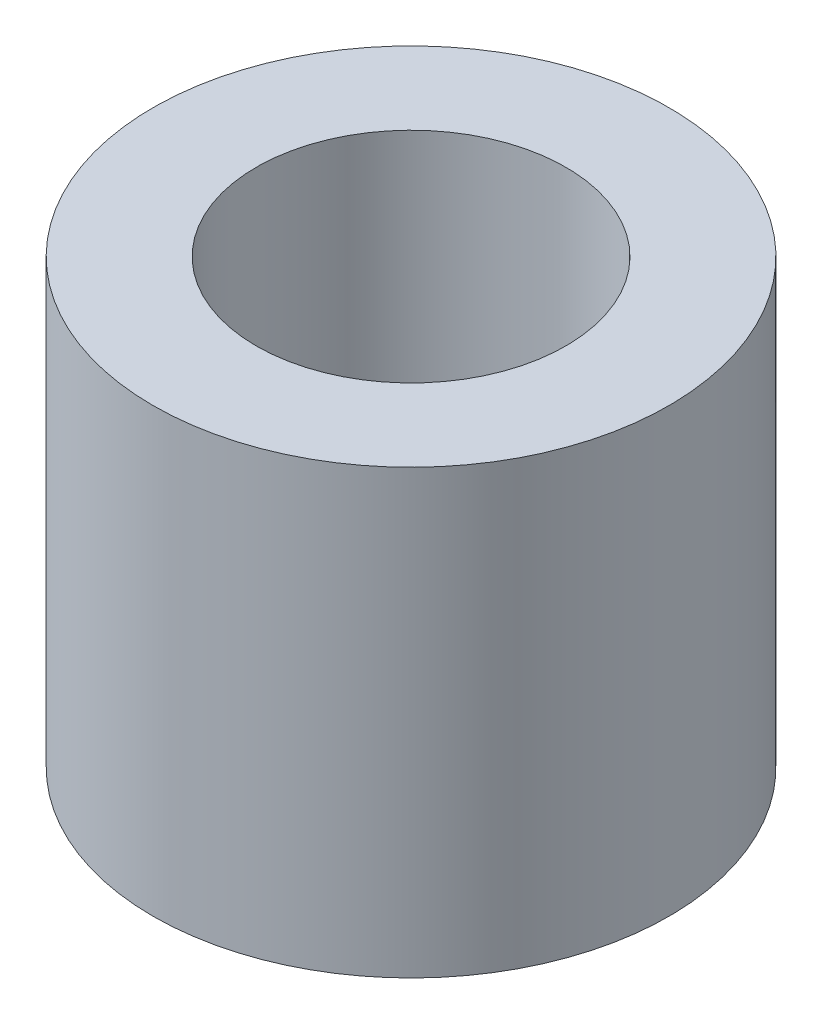
ISO-10303-21;
HEADER;
FILE_DESCRIPTION(('STEP AP214'),'2;1');
FILE_NAME('part.step','',(''),(''),'','','');
FILE_SCHEMA(('AUTOMOTIVE_DESIGN { 1 0 10303 214 1 1 1 1 }'));
ENDSEC;
DATA;
#1=APPLICATION_CONTEXT('core data for automotive mechanical design processes');
#2=APPLICATION_PROTOCOL_DEFINITION('international standard','automotive_design',2000,#1);
#3=PRODUCT_CONTEXT('',#1,'mechanical');
#4=PRODUCT('Part','Part','',(#3));
#5=PRODUCT_RELATED_PRODUCT_CATEGORY('part','',(#4));
#6=PRODUCT_DEFINITION_FORMATION('','',#4);
#7=PRODUCT_DEFINITION_CONTEXT('part definition',#1,'design');
#8=PRODUCT_DEFINITION('design','',#6,#7);
#9=PRODUCT_DEFINITION_SHAPE('','',#8);
#10=(LENGTH_UNIT() NAMED_UNIT(*) SI_UNIT(.MILLI.,.METRE.));
#11=(NAMED_UNIT(*) PLANE_ANGLE_UNIT() SI_UNIT($,.RADIAN.));
#12=(NAMED_UNIT(*) SI_UNIT($,.STERADIAN.) SOLID_ANGLE_UNIT());
#13=UNCERTAINTY_MEASURE_WITH_UNIT(LENGTH_MEASURE(1.E-05),#10,'distance_accuracy_value','');
#14=(GEOMETRIC_REPRESENTATION_CONTEXT(3) GLOBAL_UNCERTAINTY_ASSIGNED_CONTEXT((#13)) GLOBAL_UNIT_ASSIGNED_CONTEXT((#10,
#11,#12)) REPRESENTATION_CONTEXT('',''));
#15=CARTESIAN_POINT('',(0.,0.,0.));
#16=DIRECTION('',(0.,0.,1.));
#17=DIRECTION('',(1.,0.,0.));
#18=AXIS2_PLACEMENT_3D('',#15,#16,#17);
#19=CARTESIAN_POINT('',(0.,6.,0.));
#20=DIRECTION('',(0.,1.,0.));
#21=DIRECTION('',(0.,0.,1.));
#22=AXIS2_PLACEMENT_3D('',#19,#20,#21);
#23=PLANE('',#22);
#24=CARTESIAN_POINT('',(0.,6.,0.));
#25=DIRECTION('',(0.,1.,0.));
#26=DIRECTION('',(0.,0.,1.));
#27=AXIS2_PLACEMENT_3D('',#24,#25,#26);
#28=CIRCLE('',#27,3.5);
#29=CARTESIAN_POINT('',(0.,6.,3.5));
#30=VERTEX_POINT('',#29);
#31=EDGE_CURVE('E10',#30,#30,#28,.T.);
#32=ORIENTED_EDGE('',*,*,#31,.T.);
#33=EDGE_LOOP('',(#32));
#34=FACE_BOUND('',#33,.T.);
#35=CARTESIAN_POINT('',(0.,6.,0.));
#36=DIRECTION('',(0.,1.,0.));
#37=DIRECTION('',(0.,0.,1.));
#38=AXIS2_PLACEMENT_3D('',#35,#36,#37);
#39=CIRCLE('',#38,2.1);
#40=CARTESIAN_POINT('',(0.,6.,2.1));
#41=VERTEX_POINT('',#40);
#42=EDGE_CURVE('E50',#41,#41,#39,.T.);
#43=ORIENTED_EDGE('',*,*,#42,.F.);
#44=EDGE_LOOP('',(#43));
#45=FACE_BOUND('',#44,.T.);
#46=ADVANCED_FACE('F39',(#34,#45),#23,.T.);
#47=CARTESIAN_POINT('',(0.,0.,0.));
#48=DIRECTION('',(0.,1.,0.));
#49=DIRECTION('',(0.,0.,1.));
#50=AXIS2_PLACEMENT_3D('',#47,#48,#49);
#51=PLANE('',#50);
#52=CARTESIAN_POINT('',(0.,0.,0.));
#53=DIRECTION('',(0.,1.,0.));
#54=DIRECTION('',(0.,0.,1.));
#55=AXIS2_PLACEMENT_3D('',#52,#53,#54);
#56=CIRCLE('',#55,3.5);
#57=CARTESIAN_POINT('',(0.,0.,3.5));
#58=VERTEX_POINT('',#57);
#59=EDGE_CURVE('E43',#58,#58,#56,.T.);
#60=ORIENTED_EDGE('',*,*,#59,.F.);
#61=EDGE_LOOP('',(#60));
#62=FACE_BOUND('',#61,.T.);
#63=CARTESIAN_POINT('',(0.,0.,0.));
#64=DIRECTION('',(0.,1.,0.));
#65=DIRECTION('',(0.,0.,1.));
#66=AXIS2_PLACEMENT_3D('',#63,#64,#65);
#67=CIRCLE('',#66,2.1);
#68=CARTESIAN_POINT('',(0.,0.,2.1));
#69=VERTEX_POINT('',#68);
#70=EDGE_CURVE('E52',#69,#69,#67,.T.);
#71=ORIENTED_EDGE('',*,*,#70,.T.);
#72=EDGE_LOOP('',(#71));
#73=FACE_BOUND('',#72,.T.);
#74=ADVANCED_FACE('F62',(#62,#73),#51,.F.);
#75=CARTESIAN_POINT('',(0.,6.,0.));
#76=DIRECTION('',(0.,-1.,0.));
#77=DIRECTION('',(0.,0.,-1.));
#78=AXIS2_PLACEMENT_3D('',#75,#76,#77);
#79=CYLINDRICAL_SURFACE('',#78,3.5);
#80=ORIENTED_EDGE('',*,*,#31,.F.);
#81=EDGE_LOOP('',(#80));
#82=FACE_BOUND('',#81,.T.);
#83=ORIENTED_EDGE('',*,*,#59,.T.);
#84=EDGE_LOOP('',(#83));
#85=FACE_BOUND('',#84,.T.);
#86=ADVANCED_FACE('F41',(#82,#85),#79,.T.);
#87=CARTESIAN_POINT('',(0.,6.,0.));
#88=DIRECTION('',(0.,-1.,0.));
#89=DIRECTION('',(0.,0.,-1.));
#90=AXIS2_PLACEMENT_3D('',#87,#88,#89);
#91=CYLINDRICAL_SURFACE('',#90,2.1);
#92=ORIENTED_EDGE('',*,*,#42,.T.);
#93=EDGE_LOOP('',(#92));
#94=FACE_BOUND('',#93,.T.);
#95=ORIENTED_EDGE('',*,*,#70,.F.);
#96=EDGE_LOOP('',(#95));
#97=FACE_BOUND('',#96,.T.);
#98=ADVANCED_FACE('F58',(#94,#97),#91,.F.);
#99=CLOSED_SHELL('',(#46,#74,#86,#98));
#100=MANIFOLD_SOLID_BREP('B2',#99);
#101=ADVANCED_BREP_SHAPE_REPRESENTATION('',(#18,#100),#14);
#102=SHAPE_DEFINITION_REPRESENTATION(#9,#101);
ENDSEC;
END-ISO-10303-21;
